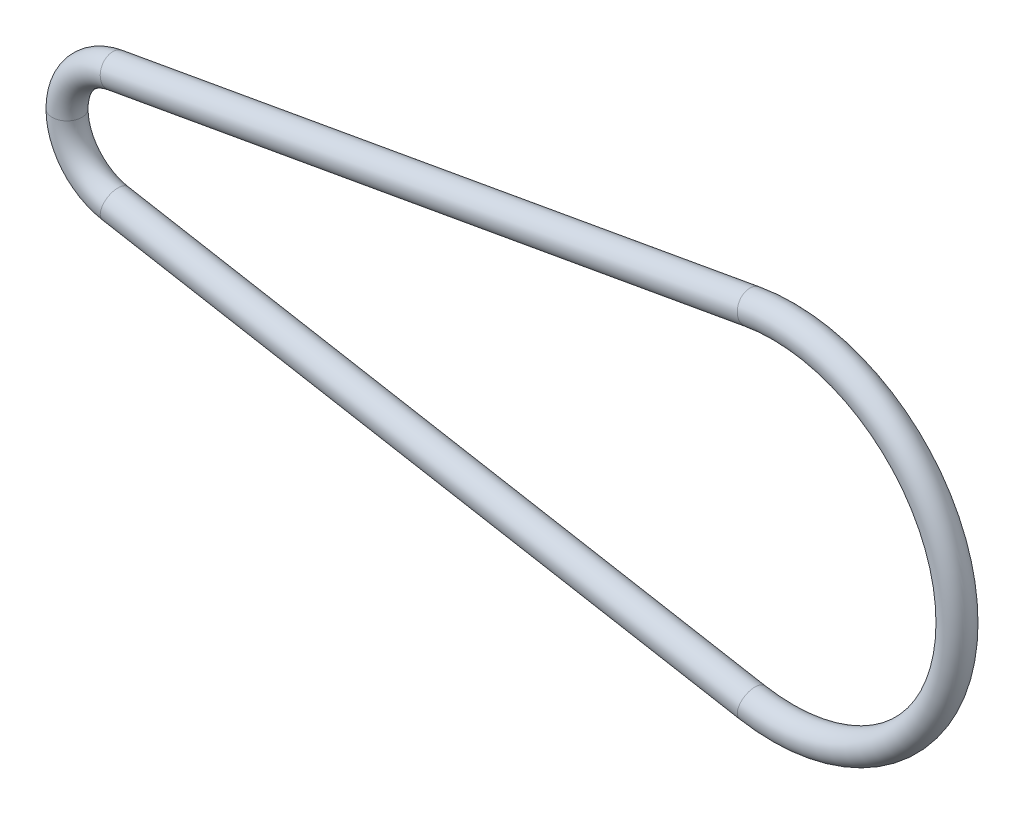
ISO-10303-21;
HEADER;
FILE_DESCRIPTION(('STEP AP214'),'2;1');
FILE_NAME('part.step','',(''),(''),'','','');
FILE_SCHEMA(('AUTOMOTIVE_DESIGN { 1 0 10303 214 1 1 1 1 }'));
ENDSEC;
DATA;
#1=APPLICATION_CONTEXT('core data for automotive mechanical design processes');
#2=APPLICATION_PROTOCOL_DEFINITION('international standard','automotive_design',2000,#1);
#3=PRODUCT_CONTEXT('',#1,'mechanical');
#4=PRODUCT('Part','Part','',(#3));
#5=PRODUCT_RELATED_PRODUCT_CATEGORY('part','',(#4));
#6=PRODUCT_DEFINITION_FORMATION('','',#4);
#7=PRODUCT_DEFINITION_CONTEXT('part definition',#1,'design');
#8=PRODUCT_DEFINITION('design','',#6,#7);
#9=PRODUCT_DEFINITION_SHAPE('','',#8);
#10=(LENGTH_UNIT() NAMED_UNIT(*) SI_UNIT(.MILLI.,.METRE.));
#11=(NAMED_UNIT(*) PLANE_ANGLE_UNIT() SI_UNIT($,.RADIAN.));
#12=(NAMED_UNIT(*) SI_UNIT($,.STERADIAN.) SOLID_ANGLE_UNIT());
#13=UNCERTAINTY_MEASURE_WITH_UNIT(LENGTH_MEASURE(1.E-05),#10,'distance_accuracy_value','');
#14=(GEOMETRIC_REPRESENTATION_CONTEXT(3) GLOBAL_UNCERTAINTY_ASSIGNED_CONTEXT((#13)) GLOBAL_UNIT_ASSIGNED_CONTEXT((#10,
#11,#12)) REPRESENTATION_CONTEXT('',''));
#15=CARTESIAN_POINT('',(0.,0.,0.));
#16=DIRECTION('',(0.,0.,1.));
#17=DIRECTION('',(1.,0.,0.));
#18=AXIS2_PLACEMENT_3D('',#15,#16,#17);
#19=CARTESIAN_POINT('',(0.,0.,0.));
#20=DIRECTION('',(0.,0.,-1.));
#21=DIRECTION('',(-1.,0.,0.));
#22=AXIS2_PLACEMENT_3D('',#19,#20,#21);
#23=TOROIDAL_SURFACE('',#22,5.1562,1.3081);
#24=CARTESIAN_POINT('',(-0.905793553177908,-5.0760158076016,0.));
#25=DIRECTION('',(-0.984448975524922,0.175670756211533,0.));
#26=DIRECTION('',(0.,0.,1.));
#27=AXIS2_PLACEMENT_3D('',#24,#25,#26);
#28=CIRCLE('',#27,1.3081);
#29=CARTESIAN_POINT('',(-1.13558846937822,-6.36377351248576,0.));
#30=VERTEX_POINT('',#29);
#31=EDGE_CURVE('E10',#30,#30,#28,.T.);
#32=CARTESIAN_POINT('',(-5.1562,0.,0.));
#33=DIRECTION('',(0.,1.,0.));
#34=DIRECTION('',(0.,0.,1.));
#35=AXIS2_PLACEMENT_3D('',#32,#33,#34);
#36=CIRCLE('',#35,1.3081);
#37=CARTESIAN_POINT('',(-6.4643,0.,0.));
#38=VERTEX_POINT('',#37);
#39=EDGE_CURVE('E50',#38,#38,#36,.T.);
#40=CARTESIAN_POINT('',(0.,0.,0.));
#41=DIRECTION('',(0.,0.,-1.));
#42=DIRECTION('',(-1.,0.,0.));
#43=AXIS2_PLACEMENT_3D('',#40,#41,#42);
#44=CIRCLE('',#43,6.4643);
#45=EDGE_CURVE('',#30,#38,#44,.T.);
#46=ORIENTED_EDGE('',*,*,#31,.T.);
#47=ORIENTED_EDGE('',*,*,#39,.F.);
#48=ORIENTED_EDGE('',*,*,#45,.T.);
#49=ORIENTED_EDGE('',*,*,#45,.F.);
#50=EDGE_LOOP('',(#46,#48,#47,#49));
#51=FACE_BOUND('',#50,.T.);
#52=ADVANCED_FACE('F31',(#51),#23,.T.);
#53=CARTESIAN_POINT('',(55.1448572900964,-15.0780173989348,0.));
#54=DIRECTION('',(-0.984448975524922,0.175670756211533,0.));
#55=DIRECTION('',(-0.175670756211533,-0.984448975524922,0.));
#56=AXIS2_PLACEMENT_3D('',#53,#54,#55);
#57=CYLINDRICAL_SURFACE('',#56,1.3081);
#58=ORIENTED_EDGE('',*,*,#31,.F.);
#59=EDGE_LOOP('',(#58));
#60=FACE_BOUND('',#59,.T.);
#61=CARTESIAN_POINT('',(55.1448572900964,-15.0780173989348,0.));
#62=DIRECTION('',(-0.984448975524922,0.175670756211533,0.));
#63=DIRECTION('',(0.,0.,1.));
#64=AXIS2_PLACEMENT_3D('',#61,#62,#63);
#65=CIRCLE('',#64,1.3081);
#66=CARTESIAN_POINT('',(54.9150623738961,-16.365775103819,0.));
#67=VERTEX_POINT('',#66);
#68=EDGE_CURVE('E37',#67,#67,#65,.T.);
#69=ORIENTED_EDGE('',*,*,#68,.T.);
#70=EDGE_LOOP('',(#69));
#71=FACE_BOUND('',#70,.T.);
#72=ADVANCED_FACE('F57',(#60,#71),#57,.T.);
#73=CARTESIAN_POINT('',(57.8354657263835,0.,0.));
#74=DIRECTION('',(0.,0.,-1.));
#75=DIRECTION('',(-1.,0.,0.));
#76=AXIS2_PLACEMENT_3D('',#73,#74,#75);
#77=TOROIDAL_SURFACE('',#76,15.3162,1.3081);
#78=CARTESIAN_POINT('',(55.1448572900964,15.0780173989348,0.));
#79=DIRECTION('',(0.984448975524922,0.175670756211533,0.));
#80=DIRECTION('',(0.,0.,1.));
#81=AXIS2_PLACEMENT_3D('',#78,#79,#80);
#82=CIRCLE('',#81,1.3081);
#83=CARTESIAN_POINT('',(54.9150623738961,16.365775103819,0.));
#84=VERTEX_POINT('',#83);
#85=EDGE_CURVE('E41',#84,#84,#82,.T.);
#86=CARTESIAN_POINT('',(57.8354657263835,0.,0.));
#87=DIRECTION('',(0.,0.,-1.));
#88=DIRECTION('',(-1.,0.,0.));
#89=AXIS2_PLACEMENT_3D('',#86,#87,#88);
#90=CIRCLE('',#89,16.6243);
#91=EDGE_CURVE('',#84,#67,#90,.T.);
#92=ORIENTED_EDGE('',*,*,#85,.T.);
#93=ORIENTED_EDGE('',*,*,#68,.F.);
#94=ORIENTED_EDGE('',*,*,#91,.T.);
#95=ORIENTED_EDGE('',*,*,#91,.F.);
#96=EDGE_LOOP('',(#92,#94,#93,#95));
#97=FACE_BOUND('',#96,.T.);
#98=ADVANCED_FACE('F61',(#97),#77,.T.);
#99=CARTESIAN_POINT('',(-0.905793553177908,5.0760158076016,0.));
#100=DIRECTION('',(0.984448975524922,0.175670756211533,0.));
#101=DIRECTION('',(-0.175670756211533,0.984448975524922,0.));
#102=AXIS2_PLACEMENT_3D('',#99,#100,#101);
#103=CYLINDRICAL_SURFACE('',#102,1.3081);
#104=ORIENTED_EDGE('',*,*,#85,.F.);
#105=EDGE_LOOP('',(#104));
#106=FACE_BOUND('',#105,.T.);
#107=CARTESIAN_POINT('',(-0.905793553177911,5.0760158076016,0.));
#108=DIRECTION('',(0.984448975524922,0.175670756211534,0.));
#109=DIRECTION('',(0.,0.,1.));
#110=AXIS2_PLACEMENT_3D('',#107,#108,#109);
#111=CIRCLE('',#110,1.3081);
#112=CARTESIAN_POINT('',(-1.13558846937822,6.36377351248575,0.));
#113=VERTEX_POINT('',#112);
#114=EDGE_CURVE('E45',#113,#113,#111,.T.);
#115=ORIENTED_EDGE('',*,*,#114,.T.);
#116=EDGE_LOOP('',(#115));
#117=FACE_BOUND('',#116,.T.);
#118=ADVANCED_FACE('F66',(#106,#117),#103,.T.);
#119=CARTESIAN_POINT('',(0.,0.,0.));
#120=DIRECTION('',(0.,0.,-1.));
#121=DIRECTION('',(-1.,0.,0.));
#122=AXIS2_PLACEMENT_3D('',#119,#120,#121);
#123=TOROIDAL_SURFACE('',#122,5.1562,1.3081);
#124=CARTESIAN_POINT('',(0.,0.,0.));
#125=DIRECTION('',(0.,0.,-1.));
#126=DIRECTION('',(-1.,0.,0.));
#127=AXIS2_PLACEMENT_3D('',#124,#125,#126);
#128=CIRCLE('',#127,6.4643);
#129=EDGE_CURVE('',#38,#113,#128,.T.);
#130=ORIENTED_EDGE('',*,*,#39,.T.);
#131=ORIENTED_EDGE('',*,*,#114,.F.);
#132=ORIENTED_EDGE('',*,*,#129,.T.);
#133=ORIENTED_EDGE('',*,*,#129,.F.);
#134=EDGE_LOOP('',(#130,#132,#131,#133));
#135=FACE_BOUND('',#134,.T.);
#136=ADVANCED_FACE('F54',(#135),#123,.T.);
#137=CLOSED_SHELL('',(#52,#72,#98,#118,#136));
#138=MANIFOLD_SOLID_BREP('B2',#137);
#139=ADVANCED_BREP_SHAPE_REPRESENTATION('',(#18,#138),#14);
#140=SHAPE_DEFINITION_REPRESENTATION(#9,#139);
ENDSEC;
END-ISO-10303-21;
